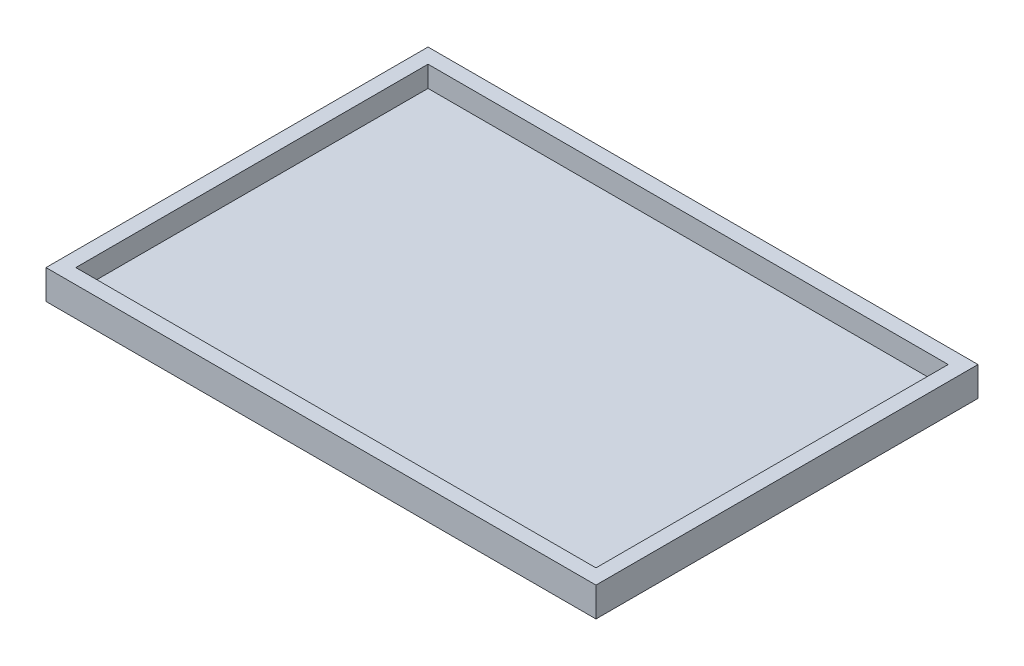
ISO-10303-21;
HEADER;
FILE_DESCRIPTION(('STEP AP214'),'2;1');
FILE_NAME('part.step','',(''),(''),'','','');
FILE_SCHEMA(('AUTOMOTIVE_DESIGN { 1 0 10303 214 1 1 1 1 }'));
ENDSEC;
DATA;
#1=APPLICATION_CONTEXT('core data for automotive mechanical design processes');
#2=APPLICATION_PROTOCOL_DEFINITION('international standard','automotive_design',2000,#1);
#3=PRODUCT_CONTEXT('',#1,'mechanical');
#4=PRODUCT('Part','Part','',(#3));
#5=PRODUCT_RELATED_PRODUCT_CATEGORY('part','',(#4));
#6=PRODUCT_DEFINITION_FORMATION('','',#4);
#7=PRODUCT_DEFINITION_CONTEXT('part definition',#1,'design');
#8=PRODUCT_DEFINITION('design','',#6,#7);
#9=PRODUCT_DEFINITION_SHAPE('','',#8);
#10=(LENGTH_UNIT() NAMED_UNIT(*) SI_UNIT(.MILLI.,.METRE.));
#11=(NAMED_UNIT(*) PLANE_ANGLE_UNIT() SI_UNIT($,.RADIAN.));
#12=(NAMED_UNIT(*) SI_UNIT($,.STERADIAN.) SOLID_ANGLE_UNIT());
#13=UNCERTAINTY_MEASURE_WITH_UNIT(LENGTH_MEASURE(1.E-05),#10,'distance_accuracy_value','');
#14=(GEOMETRIC_REPRESENTATION_CONTEXT(3) GLOBAL_UNCERTAINTY_ASSIGNED_CONTEXT((#13)) GLOBAL_UNIT_ASSIGNED_CONTEXT((#10,
#11,#12)) REPRESENTATION_CONTEXT('',''));
#15=CARTESIAN_POINT('',(0.,0.,0.));
#16=DIRECTION('',(0.,0.,1.));
#17=DIRECTION('',(1.,0.,0.));
#18=AXIS2_PLACEMENT_3D('',#15,#16,#17);
#19=CARTESIAN_POINT('',(65.5,7.,45.5));
#20=DIRECTION('',(-1.,0.,0.));
#21=DIRECTION('',(0.,0.,1.));
#22=AXIS2_PLACEMENT_3D('',#19,#20,#21);
#23=PLANE('',#22);
#24=DIRECTION('',(0.,0.,-1.));
#25=VECTOR('',#24,1.);
#26=CARTESIAN_POINT('',(65.5,0.,45.5));
#27=LINE('',#26,#25);
#28=CARTESIAN_POINT('',(65.5,0.,45.5));
#29=VERTEX_POINT('',#28);
#30=CARTESIAN_POINT('',(65.5,0.,-45.5));
#31=VERTEX_POINT('',#30);
#32=EDGE_CURVE('E158',#29,#31,#27,.T.);
#33=ORIENTED_EDGE('',*,*,#32,.T.);
#34=DIRECTION('',(0.,-1.,0.));
#35=VECTOR('',#34,1.);
#36=CARTESIAN_POINT('',(65.5,7.,-45.5));
#37=LINE('',#36,#35);
#38=CARTESIAN_POINT('',(65.5,7.,-45.5));
#39=VERTEX_POINT('',#38);
#40=EDGE_CURVE('E11',#39,#31,#37,.T.);
#41=ORIENTED_EDGE('',*,*,#40,.F.);
#42=DIRECTION('',(0.,0.,-1.));
#43=VECTOR('',#42,1.);
#44=CARTESIAN_POINT('',(65.5,7.,45.5));
#45=LINE('',#44,#43);
#46=CARTESIAN_POINT('',(65.5,7.,45.5));
#47=VERTEX_POINT('',#46);
#48=EDGE_CURVE('E164',#47,#39,#45,.T.);
#49=ORIENTED_EDGE('',*,*,#48,.F.);
#50=DIRECTION('',(0.,-1.,0.));
#51=VECTOR('',#50,1.);
#52=CARTESIAN_POINT('',(65.5,7.,45.5));
#53=LINE('',#52,#51);
#54=EDGE_CURVE('E174',#47,#29,#53,.T.);
#55=ORIENTED_EDGE('',*,*,#54,.T.);
#56=EDGE_LOOP('',(#33,#41,#49,#55));
#57=FACE_BOUND('',#56,.T.);
#58=ADVANCED_FACE('F39',(#57),#23,.F.);
#59=CARTESIAN_POINT('',(-65.5,7.,-45.5));
#60=DIRECTION('',(0.,0.,1.));
#61=DIRECTION('',(1.,0.,0.));
#62=AXIS2_PLACEMENT_3D('',#59,#60,#61);
#63=PLANE('',#62);
#64=DIRECTION('',(-1.,0.,0.));
#65=VECTOR('',#64,1.);
#66=CARTESIAN_POINT('',(-65.5,0.,-45.5));
#67=LINE('',#66,#65);
#68=CARTESIAN_POINT('',(-65.5,0.,-45.5));
#69=VERTEX_POINT('',#68);
#70=EDGE_CURVE('E178',#31,#69,#67,.T.);
#71=ORIENTED_EDGE('',*,*,#70,.T.);
#72=DIRECTION('',(0.,-1.,0.));
#73=VECTOR('',#72,1.);
#74=CARTESIAN_POINT('',(-65.5,7.,-45.5));
#75=LINE('',#74,#73);
#76=CARTESIAN_POINT('',(-65.5,7.,-45.5));
#77=VERTEX_POINT('',#76);
#78=EDGE_CURVE('E47',#77,#69,#75,.T.);
#79=ORIENTED_EDGE('',*,*,#78,.F.);
#80=DIRECTION('',(-1.,0.,0.));
#81=VECTOR('',#80,1.);
#82=CARTESIAN_POINT('',(-65.5,7.,-45.5));
#83=LINE('',#82,#81);
#84=EDGE_CURVE('E91',#39,#77,#83,.T.);
#85=ORIENTED_EDGE('',*,*,#84,.F.);
#86=ORIENTED_EDGE('',*,*,#40,.T.);
#87=EDGE_LOOP('',(#71,#79,#85,#86));
#88=FACE_BOUND('',#87,.T.);
#89=ADVANCED_FACE('F213',(#88),#63,.F.);
#90=CARTESIAN_POINT('',(-65.5,7.,45.5));
#91=DIRECTION('',(1.,0.,0.));
#92=DIRECTION('',(0.,0.,-1.));
#93=AXIS2_PLACEMENT_3D('',#90,#91,#92);
#94=PLANE('',#93);
#95=DIRECTION('',(0.,0.,1.));
#96=VECTOR('',#95,1.);
#97=CARTESIAN_POINT('',(-65.5,0.,45.5));
#98=LINE('',#97,#96);
#99=CARTESIAN_POINT('',(-65.5,0.,45.5));
#100=VERTEX_POINT('',#99);
#101=EDGE_CURVE('E181',#69,#100,#98,.T.);
#102=ORIENTED_EDGE('',*,*,#101,.T.);
#103=DIRECTION('',(0.,-1.,0.));
#104=VECTOR('',#103,1.);
#105=CARTESIAN_POINT('',(-65.5,7.,45.5));
#106=LINE('',#105,#104);
#107=CARTESIAN_POINT('',(-65.5,7.,45.5));
#108=VERTEX_POINT('',#107);
#109=EDGE_CURVE('E188',#108,#100,#106,.T.);
#110=ORIENTED_EDGE('',*,*,#109,.F.);
#111=DIRECTION('',(0.,0.,1.));
#112=VECTOR('',#111,1.);
#113=CARTESIAN_POINT('',(-65.5,7.,45.5));
#114=LINE('',#113,#112);
#115=EDGE_CURVE('E169',#77,#108,#114,.T.);
#116=ORIENTED_EDGE('',*,*,#115,.F.);
#117=ORIENTED_EDGE('',*,*,#78,.T.);
#118=EDGE_LOOP('',(#102,#110,#116,#117));
#119=FACE_BOUND('',#118,.T.);
#120=ADVANCED_FACE('F195',(#119),#94,.F.);
#121=CARTESIAN_POINT('',(-65.5,7.,45.5));
#122=DIRECTION('',(0.,0.,-1.));
#123=DIRECTION('',(-1.,0.,0.));
#124=AXIS2_PLACEMENT_3D('',#121,#122,#123);
#125=PLANE('',#124);
#126=DIRECTION('',(1.,0.,0.));
#127=VECTOR('',#126,1.);
#128=CARTESIAN_POINT('',(-65.5,0.,45.5));
#129=LINE('',#128,#127);
#130=EDGE_CURVE('E84',#100,#29,#129,.T.);
#131=ORIENTED_EDGE('',*,*,#130,.T.);
#132=ORIENTED_EDGE('',*,*,#54,.F.);
#133=DIRECTION('',(1.,0.,0.));
#134=VECTOR('',#133,1.);
#135=CARTESIAN_POINT('',(-65.5,7.,45.5));
#136=LINE('',#135,#134);
#137=EDGE_CURVE('E63',#108,#47,#136,.T.);
#138=ORIENTED_EDGE('',*,*,#137,.F.);
#139=ORIENTED_EDGE('',*,*,#109,.T.);
#140=EDGE_LOOP('',(#131,#132,#138,#139));
#141=FACE_BOUND('',#140,.T.);
#142=ADVANCED_FACE('F203',(#141),#125,.F.);
#143=CARTESIAN_POINT('',(0.,7.,0.));
#144=DIRECTION('',(0.,-1.,0.));
#145=DIRECTION('',(0.,0.,-1.));
#146=AXIS2_PLACEMENT_3D('',#143,#144,#145);
#147=PLANE('',#146);
#148=DIRECTION('',(-1.,0.,0.));
#149=VECTOR('',#148,1.);
#150=CARTESIAN_POINT('',(-61.95,7.,-41.95));
#151=LINE('',#150,#149);
#152=CARTESIAN_POINT('',(61.95,7.,-41.95));
#153=VERTEX_POINT('',#152);
#154=CARTESIAN_POINT('',(-61.95,7.,-41.95));
#155=VERTEX_POINT('',#154);
#156=EDGE_CURVE('E149',#153,#155,#151,.T.);
#157=ORIENTED_EDGE('',*,*,#156,.F.);
#158=DIRECTION('',(0.,0.,-1.));
#159=VECTOR('',#158,1.);
#160=CARTESIAN_POINT('',(61.95,7.,41.95));
#161=LINE('',#160,#159);
#162=CARTESIAN_POINT('',(61.95,7.,41.95));
#163=VERTEX_POINT('',#162);
#164=EDGE_CURVE('E54',#163,#153,#161,.T.);
#165=ORIENTED_EDGE('',*,*,#164,.F.);
#166=DIRECTION('',(1.,0.,0.));
#167=VECTOR('',#166,1.);
#168=CARTESIAN_POINT('',(-61.95,7.,41.95));
#169=LINE('',#168,#167);
#170=CARTESIAN_POINT('',(-61.95,7.,41.95));
#171=VERTEX_POINT('',#170);
#172=EDGE_CURVE('E136',#171,#163,#169,.T.);
#173=ORIENTED_EDGE('',*,*,#172,.F.);
#174=DIRECTION('',(0.,0.,1.));
#175=VECTOR('',#174,1.);
#176=CARTESIAN_POINT('',(-61.95,7.,41.95));
#177=LINE('',#176,#175);
#178=EDGE_CURVE('E140',#155,#171,#177,.T.);
#179=ORIENTED_EDGE('',*,*,#178,.F.);
#180=EDGE_LOOP('',(#157,#165,#173,#179));
#181=FACE_BOUND('',#180,.T.);
#182=ORIENTED_EDGE('',*,*,#48,.T.);
#183=ORIENTED_EDGE('',*,*,#84,.T.);
#184=ORIENTED_EDGE('',*,*,#115,.T.);
#185=ORIENTED_EDGE('',*,*,#137,.T.);
#186=EDGE_LOOP('',(#182,#183,#184,#185));
#187=FACE_BOUND('',#186,.T.);
#188=ADVANCED_FACE('F205',(#181,#187),#147,.F.);
#189=CARTESIAN_POINT('',(0.,0.,0.));
#190=DIRECTION('',(0.,-1.,0.));
#191=DIRECTION('',(0.,0.,-1.));
#192=AXIS2_PLACEMENT_3D('',#189,#190,#191);
#193=PLANE('',#192);
#194=ORIENTED_EDGE('',*,*,#32,.F.);
#195=ORIENTED_EDGE('',*,*,#130,.F.);
#196=ORIENTED_EDGE('',*,*,#101,.F.);
#197=ORIENTED_EDGE('',*,*,#70,.F.);
#198=EDGE_LOOP('',(#194,#195,#196,#197));
#199=FACE_BOUND('',#198,.T.);
#200=ADVANCED_FACE('F199',(#199),#193,.T.);
#201=CARTESIAN_POINT('',(61.95,2.,41.95));
#202=DIRECTION('',(1.,0.,0.));
#203=DIRECTION('',(0.,0.,-1.));
#204=AXIS2_PLACEMENT_3D('',#201,#202,#203);
#205=PLANE('',#204);
#206=ORIENTED_EDGE('',*,*,#164,.T.);
#207=DIRECTION('',(0.,1.,0.));
#208=VECTOR('',#207,1.);
#209=CARTESIAN_POINT('',(61.95,2.,-41.95));
#210=LINE('',#209,#208);
#211=CARTESIAN_POINT('',(61.95,2.,-41.95));
#212=VERTEX_POINT('',#211);
#213=EDGE_CURVE('E111',#212,#153,#210,.T.);
#214=ORIENTED_EDGE('',*,*,#213,.F.);
#215=DIRECTION('',(0.,0.,-1.));
#216=VECTOR('',#215,1.);
#217=CARTESIAN_POINT('',(61.95,2.,41.95));
#218=LINE('',#217,#216);
#219=CARTESIAN_POINT('',(61.95,2.,41.95));
#220=VERTEX_POINT('',#219);
#221=EDGE_CURVE('E115',#220,#212,#218,.T.);
#222=ORIENTED_EDGE('',*,*,#221,.F.);
#223=DIRECTION('',(0.,1.,0.));
#224=VECTOR('',#223,1.);
#225=CARTESIAN_POINT('',(61.95,2.,41.95));
#226=LINE('',#225,#224);
#227=EDGE_CURVE('E155',#220,#163,#226,.T.);
#228=ORIENTED_EDGE('',*,*,#227,.T.);
#229=EDGE_LOOP('',(#206,#214,#222,#228));
#230=FACE_BOUND('',#229,.T.);
#231=ADVANCED_FACE('F113',(#230),#205,.F.);
#232=CARTESIAN_POINT('',(-61.95,2.,41.95));
#233=DIRECTION('',(0.,0.,1.));
#234=DIRECTION('',(1.,0.,0.));
#235=AXIS2_PLACEMENT_3D('',#232,#233,#234);
#236=PLANE('',#235);
#237=ORIENTED_EDGE('',*,*,#172,.T.);
#238=ORIENTED_EDGE('',*,*,#227,.F.);
#239=DIRECTION('',(1.,0.,0.));
#240=VECTOR('',#239,1.);
#241=CARTESIAN_POINT('',(-61.95,2.,41.95));
#242=LINE('',#241,#240);
#243=CARTESIAN_POINT('',(-61.95,2.,41.95));
#244=VERTEX_POINT('',#243);
#245=EDGE_CURVE('E122',#244,#220,#242,.T.);
#246=ORIENTED_EDGE('',*,*,#245,.F.);
#247=DIRECTION('',(0.,1.,0.));
#248=VECTOR('',#247,1.);
#249=CARTESIAN_POINT('',(-61.95,2.,41.95));
#250=LINE('',#249,#248);
#251=EDGE_CURVE('E159',#244,#171,#250,.T.);
#252=ORIENTED_EDGE('',*,*,#251,.T.);
#253=EDGE_LOOP('',(#237,#238,#246,#252));
#254=FACE_BOUND('',#253,.T.);
#255=ADVANCED_FACE('F252',(#254),#236,.F.);
#256=CARTESIAN_POINT('',(-61.95,2.,41.95));
#257=DIRECTION('',(-1.,0.,0.));
#258=DIRECTION('',(0.,0.,1.));
#259=AXIS2_PLACEMENT_3D('',#256,#257,#258);
#260=PLANE('',#259);
#261=ORIENTED_EDGE('',*,*,#178,.T.);
#262=ORIENTED_EDGE('',*,*,#251,.F.);
#263=DIRECTION('',(0.,0.,1.));
#264=VECTOR('',#263,1.);
#265=CARTESIAN_POINT('',(-61.95,2.,41.95));
#266=LINE('',#265,#264);
#267=CARTESIAN_POINT('',(-61.95,2.,-41.95));
#268=VERTEX_POINT('',#267);
#269=EDGE_CURVE('E131',#268,#244,#266,.T.);
#270=ORIENTED_EDGE('',*,*,#269,.F.);
#271=DIRECTION('',(0.,1.,0.));
#272=VECTOR('',#271,1.);
#273=CARTESIAN_POINT('',(-61.95,2.,-41.95));
#274=LINE('',#273,#272);
#275=EDGE_CURVE('E121',#268,#155,#274,.T.);
#276=ORIENTED_EDGE('',*,*,#275,.T.);
#277=EDGE_LOOP('',(#261,#262,#270,#276));
#278=FACE_BOUND('',#277,.T.);
#279=ADVANCED_FACE('F261',(#278),#260,.F.);
#280=CARTESIAN_POINT('',(-61.95,2.,-41.95));
#281=DIRECTION('',(0.,0.,-1.));
#282=DIRECTION('',(-1.,0.,0.));
#283=AXIS2_PLACEMENT_3D('',#280,#281,#282);
#284=PLANE('',#283);
#285=ORIENTED_EDGE('',*,*,#156,.T.);
#286=ORIENTED_EDGE('',*,*,#275,.F.);
#287=DIRECTION('',(-1.,0.,0.));
#288=VECTOR('',#287,1.);
#289=CARTESIAN_POINT('',(-61.95,2.,-41.95));
#290=LINE('',#289,#288);
#291=EDGE_CURVE('E125',#212,#268,#290,.T.);
#292=ORIENTED_EDGE('',*,*,#291,.F.);
#293=ORIENTED_EDGE('',*,*,#213,.T.);
#294=EDGE_LOOP('',(#285,#286,#292,#293));
#295=FACE_BOUND('',#294,.T.);
#296=ADVANCED_FACE('F126',(#295),#284,.F.);
#297=CARTESIAN_POINT('',(0.,2.,0.));
#298=DIRECTION('',(0.,-1.,0.));
#299=DIRECTION('',(0.,0.,-1.));
#300=AXIS2_PLACEMENT_3D('',#297,#298,#299);
#301=PLANE('',#300);
#302=ORIENTED_EDGE('',*,*,#221,.T.);
#303=ORIENTED_EDGE('',*,*,#291,.T.);
#304=ORIENTED_EDGE('',*,*,#269,.T.);
#305=ORIENTED_EDGE('',*,*,#245,.T.);
#306=EDGE_LOOP('',(#302,#303,#304,#305));
#307=FACE_BOUND('',#306,.T.);
#308=ADVANCED_FACE('F133',(#307),#301,.F.);
#309=CLOSED_SHELL('',(#58,#89,#120,#142,#188,#200,#231,#255,#279,#296,#308));
#310=MANIFOLD_SOLID_BREP('B2',#309);
#311=ADVANCED_BREP_SHAPE_REPRESENTATION('',(#18,#310),#14);
#312=SHAPE_DEFINITION_REPRESENTATION(#9,#311);
ENDSEC;
END-ISO-10303-21;
